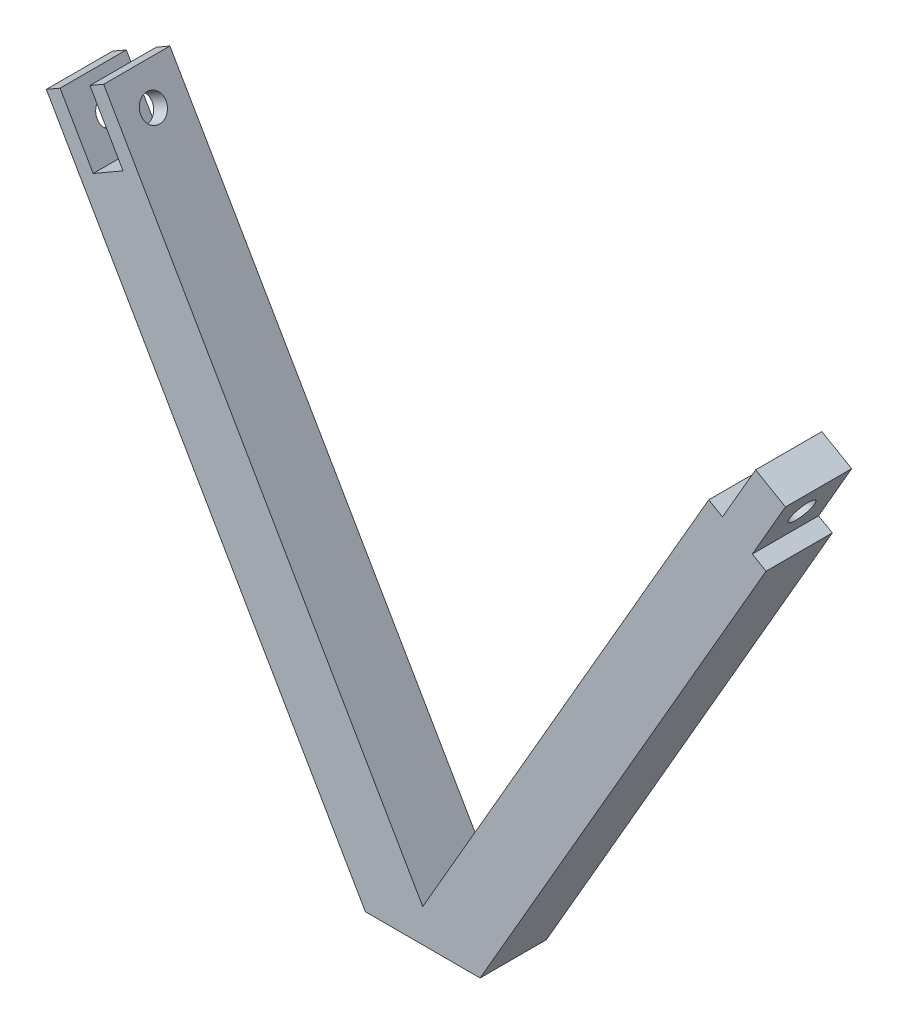
ISO-10303-21;
HEADER;
FILE_DESCRIPTION(('STEP AP214'),'2;1');
FILE_NAME('part.step','',(''),(''),'','','');
FILE_SCHEMA(('AUTOMOTIVE_DESIGN { 1 0 10303 214 1 1 1 1 }'));
ENDSEC;
DATA;
#1=APPLICATION_CONTEXT('core data for automotive mechanical design processes');
#2=APPLICATION_PROTOCOL_DEFINITION('international standard','automotive_design',2000,#1);
#3=PRODUCT_CONTEXT('',#1,'mechanical');
#4=PRODUCT('Part','Part','',(#3));
#5=PRODUCT_RELATED_PRODUCT_CATEGORY('part','',(#4));
#6=PRODUCT_DEFINITION_FORMATION('','',#4);
#7=PRODUCT_DEFINITION_CONTEXT('part definition',#1,'design');
#8=PRODUCT_DEFINITION('design','',#6,#7);
#9=PRODUCT_DEFINITION_SHAPE('','',#8);
#10=(LENGTH_UNIT() NAMED_UNIT(*) SI_UNIT(.MILLI.,.METRE.));
#11=(NAMED_UNIT(*) PLANE_ANGLE_UNIT() SI_UNIT($,.RADIAN.));
#12=(NAMED_UNIT(*) SI_UNIT($,.STERADIAN.) SOLID_ANGLE_UNIT());
#13=UNCERTAINTY_MEASURE_WITH_UNIT(LENGTH_MEASURE(1.E-05),#10,'distance_accuracy_value','');
#14=(GEOMETRIC_REPRESENTATION_CONTEXT(3) GLOBAL_UNCERTAINTY_ASSIGNED_CONTEXT((#13)) GLOBAL_UNIT_ASSIGNED_CONTEXT((#10,
#11,#12)) REPRESENTATION_CONTEXT('',''));
#15=CARTESIAN_POINT('',(0.,0.,0.));
#16=DIRECTION('',(0.,0.,1.));
#17=DIRECTION('',(1.,0.,0.));
#18=AXIS2_PLACEMENT_3D('',#15,#16,#17);
#19=CARTESIAN_POINT('',(0.,2.5,0.));
#20=DIRECTION('',(0.,1.,0.));
#21=DIRECTION('',(0.,0.,1.));
#22=AXIS2_PLACEMENT_3D('',#19,#20,#21);
#23=PLANE('',#22);
#24=DIRECTION('',(1.,0.,0.));
#25=VECTOR('',#24,1.);
#26=CARTESIAN_POINT('',(-47.8349364905389,2.5,2.5));
#27=LINE('',#26,#25);
#28=CARTESIAN_POINT('',(-54.3301270189222,2.5,2.5));
#29=VERTEX_POINT('',#28);
#30=CARTESIAN_POINT('',(-45.6698729810778,2.5,2.5));
#31=VERTEX_POINT('',#30);
#32=EDGE_CURVE('E225',#29,#31,#27,.T.);
#33=ORIENTED_EDGE('',*,*,#32,.F.);
#34=DIRECTION('',(0.,0.,-1.));
#35=VECTOR('',#34,1.);
#36=CARTESIAN_POINT('',(-54.3301270189222,2.5,7.5));
#37=LINE('',#36,#35);
#38=CARTESIAN_POINT('',(-54.3301270189222,2.5,-2.5));
#39=VERTEX_POINT('',#38);
#40=EDGE_CURVE('E74',#29,#39,#37,.T.);
#41=ORIENTED_EDGE('',*,*,#40,.T.);
#42=DIRECTION('',(-1.,0.,0.));
#43=VECTOR('',#42,1.);
#44=CARTESIAN_POINT('',(-47.8349364905389,2.5,-2.5));
#45=LINE('',#44,#43);
#46=CARTESIAN_POINT('',(-45.6698729810778,2.50000000000002,-2.5));
#47=VERTEX_POINT('',#46);
#48=EDGE_CURVE('E228',#47,#39,#45,.T.);
#49=ORIENTED_EDGE('',*,*,#48,.F.);
#50=DIRECTION('',(0.,0.,-1.));
#51=VECTOR('',#50,1.);
#52=CARTESIAN_POINT('',(-45.6698729810778,2.50000000000002,7.5));
#53=LINE('',#52,#51);
#54=EDGE_CURVE('E120',#31,#47,#53,.T.);
#55=ORIENTED_EDGE('',*,*,#54,.F.);
#56=EDGE_LOOP('',(#33,#41,#49,#55));
#57=FACE_BOUND('',#56,.T.);
#58=ADVANCED_FACE('F71',(#57),#23,.F.);
#59=CARTESIAN_POINT('',(-72.8349364905391,44.5512701892218,0.));
#60=DIRECTION('',(-0.866025403784436,-0.500000000000004,0.));
#61=DIRECTION('',(0.,0.,1.));
#62=AXIS2_PLACEMENT_3D('',#59,#60,#61);
#63=CYLINDRICAL_SURFACE('',#62,0.95);
#64=CARTESIAN_POINT('',(-72.8349364905391,44.5512701892218,0.));
#65=DIRECTION('',(-0.866025403784436,-0.500000000000004,0.));
#66=DIRECTION('',(0.,0.,1.));
#67=AXIS2_PLACEMENT_3D('',#64,#65,#66);
#68=CIRCLE('',#67,0.95);
#69=CARTESIAN_POINT('',(-72.8349364905391,44.5512701892218,0.95));
#70=VERTEX_POINT('',#69);
#71=EDGE_CURVE('E533',#70,#70,#68,.T.);
#72=ORIENTED_EDGE('',*,*,#71,.F.);
#73=EDGE_LOOP('',(#72));
#74=FACE_BOUND('',#73,.T.);
#75=CARTESIAN_POINT('',(-73.8741669750804,43.9512701892218,0.));
#76=DIRECTION('',(-0.866025403784436,-0.500000000000004,0.));
#77=DIRECTION('',(0.,0.,1.));
#78=AXIS2_PLACEMENT_3D('',#75,#76,#77);
#79=CIRCLE('',#78,0.95);
#80=CARTESIAN_POINT('',(-73.8741669750804,43.9512701892218,0.95));
#81=VERTEX_POINT('',#80);
#82=EDGE_CURVE('E515',#81,#81,#79,.T.);
#83=ORIENTED_EDGE('',*,*,#82,.T.);
#84=EDGE_LOOP('',(#83));
#85=FACE_BOUND('',#84,.T.);
#86=ADVANCED_FACE('F316',(#74,#85),#63,.F.);
#87=CARTESIAN_POINT('',(-26.1258330249199,43.951270189222,0.));
#88=DIRECTION('',(0.86602540378444,-0.499999999999998,0.));
#89=DIRECTION('',(0.,0.,-1.));
#90=AXIS2_PLACEMENT_3D('',#87,#88,#89);
#91=CYLINDRICAL_SURFACE('',#90,0.95);
#92=CARTESIAN_POINT('',(-26.1258330249199,43.951270189222,0.));
#93=DIRECTION('',(-0.86602540378444,0.499999999999998,0.));
#94=DIRECTION('',(0.,0.,1.));
#95=AXIS2_PLACEMENT_3D('',#92,#93,#94);
#96=CIRCLE('',#95,0.95);
#97=CARTESIAN_POINT('',(-26.1258330249199,43.951270189222,0.95));
#98=VERTEX_POINT('',#97);
#99=EDGE_CURVE('E166',#98,#98,#96,.T.);
#100=ORIENTED_EDGE('',*,*,#99,.T.);
#101=EDGE_LOOP('',(#100));
#102=FACE_BOUND('',#101,.T.);
#103=CARTESIAN_POINT('',(-23.8741669750803,42.651270189222,0.));
#104=DIRECTION('',(-0.86602540378444,0.499999999999998,0.));
#105=DIRECTION('',(0.,0.,1.));
#106=AXIS2_PLACEMENT_3D('',#103,#104,#105);
#107=CIRCLE('',#106,0.95);
#108=CARTESIAN_POINT('',(-23.8741669750803,42.651270189222,0.95));
#109=VERTEX_POINT('',#108);
#110=EDGE_CURVE('E174',#109,#109,#107,.T.);
#111=ORIENTED_EDGE('',*,*,#110,.F.);
#112=EDGE_LOOP('',(#111));
#113=FACE_BOUND('',#112,.T.);
#114=ADVANCED_FACE('F320',(#102,#113),#91,.F.);
#115=CARTESIAN_POINT('',(-77.1650635094613,42.0512701892218,0.));
#116=DIRECTION('',(0.866025403784436,0.500000000000004,0.));
#117=DIRECTION('',(0.,0.,-1.));
#118=AXIS2_PLACEMENT_3D('',#115,#116,#117);
#119=CYLINDRICAL_SURFACE('',#118,0.95);
#120=CARTESIAN_POINT('',(-77.1650635094613,42.0512701892218,0.));
#121=DIRECTION('',(-0.866025403784436,-0.500000000000004,0.));
#122=DIRECTION('',(0.,0.,1.));
#123=AXIS2_PLACEMENT_3D('',#120,#121,#122);
#124=CIRCLE('',#123,0.95);
#125=CARTESIAN_POINT('',(-77.1650635094613,42.0512701892218,0.95));
#126=VERTEX_POINT('',#125);
#127=EDGE_CURVE('E227',#126,#126,#124,.T.);
#128=ORIENTED_EDGE('',*,*,#127,.T.);
#129=EDGE_LOOP('',(#128));
#130=FACE_BOUND('',#129,.T.);
#131=CARTESIAN_POINT('',(-76.12583302492,42.6512701892218,0.));
#132=DIRECTION('',(-0.866025403784436,-0.500000000000004,0.));
#133=DIRECTION('',(0.,0.,1.));
#134=AXIS2_PLACEMENT_3D('',#131,#132,#133);
#135=CIRCLE('',#134,0.95);
#136=CARTESIAN_POINT('',(-76.12583302492,42.6512701892218,0.95));
#137=VERTEX_POINT('',#136);
#138=EDGE_CURVE('E510',#137,#137,#135,.T.);
#139=ORIENTED_EDGE('',*,*,#138,.F.);
#140=EDGE_LOOP('',(#139));
#141=FACE_BOUND('',#140,.T.);
#142=ADVANCED_FACE('F326',(#130,#141),#119,.F.);
#143=CARTESIAN_POINT('',(-78.4150635094613,44.2163336986829,-2.5));
#144=DIRECTION('',(0.500000000000004,-0.866025403784436,0.));
#145=DIRECTION('',(0.,0.,1.));
#146=AXIS2_PLACEMENT_3D('',#143,#144,#145);
#147=PLANE('',#146);
#148=DIRECTION('',(0.,0.,-1.));
#149=VECTOR('',#148,1.);
#150=CARTESIAN_POINT('',(-77.37583302492,44.8163336986829,-2.5));
#151=LINE('',#150,#149);
#152=CARTESIAN_POINT('',(-77.37583302492,44.8163336986829,2.5));
#153=VERTEX_POINT('',#152);
#154=CARTESIAN_POINT('',(-77.37583302492,44.8163336986829,-2.5));
#155=VERTEX_POINT('',#154);
#156=EDGE_CURVE('E506',#153,#155,#151,.T.);
#157=ORIENTED_EDGE('',*,*,#156,.T.);
#158=DIRECTION('',(0.866025403784436,0.500000000000004,0.));
#159=VECTOR('',#158,1.);
#160=CARTESIAN_POINT('',(-78.4150635094613,44.2163336986829,-2.5));
#161=LINE('',#160,#159);
#162=CARTESIAN_POINT('',(-78.4150635094613,44.2163336986829,-2.5));
#163=VERTEX_POINT('',#162);
#164=EDGE_CURVE('E81',#163,#155,#161,.T.);
#165=ORIENTED_EDGE('',*,*,#164,.F.);
#166=DIRECTION('',(0.,0.,-1.));
#167=VECTOR('',#166,1.);
#168=CARTESIAN_POINT('',(-78.4150635094613,44.2163336986829,-2.5));
#169=LINE('',#168,#167);
#170=CARTESIAN_POINT('',(-78.4150635094613,44.2163336986829,2.5));
#171=VERTEX_POINT('',#170);
#172=EDGE_CURVE('E196',#171,#163,#169,.T.);
#173=ORIENTED_EDGE('',*,*,#172,.F.);
#174=DIRECTION('',(0.866025403784436,0.500000000000004,0.));
#175=VECTOR('',#174,1.);
#176=CARTESIAN_POINT('',(-78.4150635094613,44.2163336986829,2.5));
#177=LINE('',#176,#175);
#178=EDGE_CURVE('E508',#171,#153,#177,.T.);
#179=ORIENTED_EDGE('',*,*,#178,.T.);
#180=EDGE_LOOP('',(#157,#165,#173,#179));
#181=FACE_BOUND('',#180,.T.);
#182=ADVANCED_FACE('F333',(#181),#147,.F.);
#183=CARTESIAN_POINT('',(-76.12583302492,42.6512701892218,0.));
#184=DIRECTION('',(-0.866025403784436,-0.500000000000004,0.));
#185=DIRECTION('',(0.,0.,1.));
#186=AXIS2_PLACEMENT_3D('',#183,#184,#185);
#187=PLANE('',#186);
#188=ORIENTED_EDGE('',*,*,#156,.F.);
#189=DIRECTION('',(-0.500000000000004,0.866025403784436,0.));
#190=VECTOR('',#189,1.);
#191=CARTESIAN_POINT('',(-74.87583302492,40.4862066797607,2.5));
#192=LINE('',#191,#190);
#193=CARTESIAN_POINT('',(-74.87583302492,40.4862066797607,2.5));
#194=VERTEX_POINT('',#193);
#195=EDGE_CURVE('E222',#194,#153,#192,.T.);
#196=ORIENTED_EDGE('',*,*,#195,.F.);
#197=DIRECTION('',(0.,0.,1.));
#198=VECTOR('',#197,1.);
#199=CARTESIAN_POINT('',(-74.87583302492,40.4862066797607,-2.5));
#200=LINE('',#199,#198);
#201=CARTESIAN_POINT('',(-74.87583302492,40.4862066797607,-2.5));
#202=VERTEX_POINT('',#201);
#203=EDGE_CURVE('E523',#202,#194,#200,.T.);
#204=ORIENTED_EDGE('',*,*,#203,.F.);
#205=DIRECTION('',(0.500000000000004,-0.866025403784436,0.));
#206=VECTOR('',#205,1.);
#207=CARTESIAN_POINT('',(-74.87583302492,40.4862066797607,-2.5));
#208=LINE('',#207,#206);
#209=EDGE_CURVE('E520',#155,#202,#208,.T.);
#210=ORIENTED_EDGE('',*,*,#209,.F.);
#211=EDGE_LOOP('',(#188,#196,#204,#210));
#212=FACE_BOUND('',#211,.T.);
#213=ORIENTED_EDGE('',*,*,#138,.T.);
#214=EDGE_LOOP('',(#213));
#215=FACE_BOUND('',#214,.T.);
#216=ADVANCED_FACE('F346',(#212,#215),#187,.F.);
#217=CARTESIAN_POINT('',(-73.7500000000002,41.1362066797607,0.));
#218=DIRECTION('',(0.500000000000004,-0.866025403784436,0.));
#219=DIRECTION('',(0.,0.,1.));
#220=AXIS2_PLACEMENT_3D('',#217,#218,#219);
#221=PLANE('',#220);
#222=DIRECTION('',(0.866025403784436,0.500000000000004,0.));
#223=VECTOR('',#222,1.);
#224=CARTESIAN_POINT('',(-75.9150635094613,39.8862066797607,-2.5));
#225=LINE('',#224,#223);
#226=CARTESIAN_POINT('',(-72.6241669750804,41.7862066797607,-2.5));
#227=VERTEX_POINT('',#226);
#228=EDGE_CURVE('E216',#202,#227,#225,.T.);
#229=ORIENTED_EDGE('',*,*,#228,.F.);
#230=ORIENTED_EDGE('',*,*,#203,.T.);
#231=DIRECTION('',(-0.866025403784436,-0.500000000000004,0.));
#232=VECTOR('',#231,1.);
#233=CARTESIAN_POINT('',(-75.9150635094613,39.8862066797607,2.5));
#234=LINE('',#233,#232);
#235=CARTESIAN_POINT('',(-72.6241669750804,41.7862066797607,2.5));
#236=VERTEX_POINT('',#235);
#237=EDGE_CURVE('E529',#236,#194,#234,.T.);
#238=ORIENTED_EDGE('',*,*,#237,.F.);
#239=DIRECTION('',(0.,0.,1.));
#240=VECTOR('',#239,1.);
#241=CARTESIAN_POINT('',(-72.6241669750804,41.7862066797607,-2.5));
#242=LINE('',#241,#240);
#243=EDGE_CURVE('E554',#227,#236,#242,.T.);
#244=ORIENTED_EDGE('',*,*,#243,.F.);
#245=EDGE_LOOP('',(#229,#230,#238,#244));
#246=FACE_BOUND('',#245,.T.);
#247=ADVANCED_FACE('F339',(#246),#221,.F.);
#248=CARTESIAN_POINT('',(-73.8741669750804,43.9512701892218,0.));
#249=DIRECTION('',(-0.866025403784436,-0.500000000000004,0.));
#250=DIRECTION('',(0.,0.,1.));
#251=AXIS2_PLACEMENT_3D('',#248,#249,#250);
#252=PLANE('',#251);
#253=ORIENTED_EDGE('',*,*,#82,.F.);
#254=EDGE_LOOP('',(#253));
#255=FACE_BOUND('',#254,.T.);
#256=DIRECTION('',(0.,0.,-1.));
#257=VECTOR('',#256,1.);
#258=CARTESIAN_POINT('',(-75.1241669750805,46.1163336986829,-2.5));
#259=LINE('',#258,#257);
#260=CARTESIAN_POINT('',(-75.1241669750805,46.1163336986829,2.5));
#261=VERTEX_POINT('',#260);
#262=CARTESIAN_POINT('',(-75.1241669750805,46.1163336986829,-2.5));
#263=VERTEX_POINT('',#262);
#264=EDGE_CURVE('E546',#261,#263,#259,.T.);
#265=ORIENTED_EDGE('',*,*,#264,.T.);
#266=DIRECTION('',(0.500000000000004,-0.866025403784436,0.));
#267=VECTOR('',#266,1.);
#268=CARTESIAN_POINT('',(-72.6241669750804,41.7862066797607,-2.5));
#269=LINE('',#268,#267);
#270=EDGE_CURVE('E550',#263,#227,#269,.T.);
#271=ORIENTED_EDGE('',*,*,#270,.T.);
#272=ORIENTED_EDGE('',*,*,#243,.T.);
#273=DIRECTION('',(-0.500000000000004,0.866025403784436,0.));
#274=VECTOR('',#273,1.);
#275=CARTESIAN_POINT('',(-72.6241669750804,41.7862066797607,2.5));
#276=LINE('',#275,#274);
#277=EDGE_CURVE('E541',#236,#261,#276,.T.);
#278=ORIENTED_EDGE('',*,*,#277,.T.);
#279=EDGE_LOOP('',(#265,#271,#272,#278));
#280=FACE_BOUND('',#279,.T.);
#281=ADVANCED_FACE('F335',(#255,#280),#252,.T.);
#282=CARTESIAN_POINT('',(-74.0849364905391,46.7163336986829,-2.5));
#283=DIRECTION('',(-0.500000000000004,0.866025403784436,0.));
#284=DIRECTION('',(0.,0.,-1.));
#285=AXIS2_PLACEMENT_3D('',#282,#283,#284);
#286=PLANE('',#285);
#287=ORIENTED_EDGE('',*,*,#264,.F.);
#288=DIRECTION('',(-0.866025403784436,-0.500000000000004,0.));
#289=VECTOR('',#288,1.);
#290=CARTESIAN_POINT('',(-74.0849364905391,46.7163336986829,2.5));
#291=LINE('',#290,#289);
#292=CARTESIAN_POINT('',(-74.0849364905391,46.7163336986829,2.5));
#293=VERTEX_POINT('',#292);
#294=EDGE_CURVE('E561',#293,#261,#291,.T.);
#295=ORIENTED_EDGE('',*,*,#294,.F.);
#296=DIRECTION('',(0.,0.,-1.));
#297=VECTOR('',#296,1.);
#298=CARTESIAN_POINT('',(-74.0849364905391,46.7163336986829,-2.5));
#299=LINE('',#298,#297);
#300=CARTESIAN_POINT('',(-74.0849364905391,46.7163336986829,-2.5));
#301=VERTEX_POINT('',#300);
#302=EDGE_CURVE('E537',#293,#301,#299,.T.);
#303=ORIENTED_EDGE('',*,*,#302,.T.);
#304=DIRECTION('',(-0.866025403784436,-0.500000000000004,0.));
#305=VECTOR('',#304,1.);
#306=CARTESIAN_POINT('',(-74.0849364905391,46.7163336986829,-2.5));
#307=LINE('',#306,#305);
#308=EDGE_CURVE('E545',#301,#263,#307,.T.);
#309=ORIENTED_EDGE('',*,*,#308,.T.);
#310=EDGE_LOOP('',(#287,#295,#303,#309));
#311=FACE_BOUND('',#310,.T.);
#312=ADVANCED_FACE('F338',(#311),#286,.T.);
#313=CARTESIAN_POINT('',(-47.8349364905389,1.25000000000001,-2.5));
#314=DIRECTION('',(-0.866025403784436,-0.500000000000004,0.));
#315=DIRECTION('',(0.,0.,1.));
#316=AXIS2_PLACEMENT_3D('',#313,#314,#315);
#317=PLANE('',#316);
#318=DIRECTION('',(-0.500000000000004,0.866025403784436,0.));
#319=VECTOR('',#318,1.);
#320=CARTESIAN_POINT('',(-47.8349364905389,1.25000000000001,2.5));
#321=LINE('',#320,#319);
#322=CARTESIAN_POINT('',(-50.,5.,2.5));
#323=VERTEX_POINT('',#322);
#324=EDGE_CURVE('E564',#323,#293,#321,.T.);
#325=ORIENTED_EDGE('',*,*,#324,.F.);
#326=DIRECTION('',(0.,0.,-1.));
#327=VECTOR('',#326,1.);
#328=CARTESIAN_POINT('',(-50.,5.,7.5));
#329=LINE('',#328,#327);
#330=CARTESIAN_POINT('',(-50.,5.,-2.5));
#331=VERTEX_POINT('',#330);
#332=EDGE_CURVE('E192',#323,#331,#329,.T.);
#333=ORIENTED_EDGE('',*,*,#332,.T.);
#334=DIRECTION('',(-0.500000000000004,0.866025403784436,0.));
#335=VECTOR('',#334,1.);
#336=CARTESIAN_POINT('',(-47.8349364905389,1.25000000000001,-2.5));
#337=LINE('',#336,#335);
#338=EDGE_CURVE('E197',#331,#301,#337,.T.);
#339=ORIENTED_EDGE('',*,*,#338,.T.);
#340=ORIENTED_EDGE('',*,*,#302,.F.);
#341=EDGE_LOOP('',(#325,#333,#339,#340));
#342=FACE_BOUND('',#341,.T.);
#343=ORIENTED_EDGE('',*,*,#71,.T.);
#344=EDGE_LOOP('',(#343));
#345=FACE_BOUND('',#344,.T.);
#346=ADVANCED_FACE('F310',(#342,#345),#317,.F.);
#347=CARTESIAN_POINT('',(-52.1650635094611,1.24999999999999,-2.5));
#348=DIRECTION('',(0.86602540378444,-0.499999999999998,0.));
#349=DIRECTION('',(0.,0.,-1.));
#350=AXIS2_PLACEMENT_3D('',#347,#348,#349);
#351=PLANE('',#350);
#352=ORIENTED_EDGE('',*,*,#332,.F.);
#353=DIRECTION('',(0.499999999999998,0.86602540378444,0.));
#354=VECTOR('',#353,1.);
#355=CARTESIAN_POINT('',(-52.1650635094611,1.24999999999999,2.5));
#356=LINE('',#355,#354);
#357=CARTESIAN_POINT('',(-28.4150635094612,42.3862066797609,2.5));
#358=VERTEX_POINT('',#357);
#359=EDGE_CURVE('E212',#323,#358,#356,.T.);
#360=ORIENTED_EDGE('',*,*,#359,.T.);
#361=DIRECTION('',(0.,0.,-1.));
#362=VECTOR('',#361,1.);
#363=CARTESIAN_POINT('',(-28.4150635094612,42.3862066797609,-2.5));
#364=LINE('',#363,#362);
#365=CARTESIAN_POINT('',(-28.4150635094612,42.3862066797609,-2.5));
#366=VERTEX_POINT('',#365);
#367=EDGE_CURVE('E200',#358,#366,#364,.T.);
#368=ORIENTED_EDGE('',*,*,#367,.T.);
#369=DIRECTION('',(0.499999999999998,0.86602540378444,0.));
#370=VECTOR('',#369,1.);
#371=CARTESIAN_POINT('',(-52.1650635094611,1.24999999999999,-2.5));
#372=LINE('',#371,#370);
#373=EDGE_CURVE('E204',#331,#366,#372,.T.);
#374=ORIENTED_EDGE('',*,*,#373,.F.);
#375=EDGE_LOOP('',(#352,#360,#368,#374));
#376=FACE_BOUND('',#375,.T.);
#377=ADVANCED_FACE('F297',(#376),#351,.F.);
#378=CARTESIAN_POINT('',(-26.2500000000001,41.1362066797609,0.));
#379=DIRECTION('',(-0.499999999999998,-0.86602540378444,0.));
#380=DIRECTION('',(0.,0.,1.));
#381=AXIS2_PLACEMENT_3D('',#378,#379,#380);
#382=PLANE('',#381);
#383=DIRECTION('',(0.,0.,1.));
#384=VECTOR('',#383,1.);
#385=CARTESIAN_POINT('',(-27.3758330249199,41.7862066797609,-2.5));
#386=LINE('',#385,#384);
#387=CARTESIAN_POINT('',(-27.3758330249199,41.7862066797609,-2.5));
#388=VERTEX_POINT('',#387);
#389=CARTESIAN_POINT('',(-27.3758330249199,41.7862066797609,2.5));
#390=VERTEX_POINT('',#389);
#391=EDGE_CURVE('E90',#388,#390,#386,.T.);
#392=ORIENTED_EDGE('',*,*,#391,.F.);
#393=DIRECTION('',(0.86602540378444,-0.499999999999998,0.));
#394=VECTOR('',#393,1.);
#395=CARTESIAN_POINT('',(-28.4150635094612,42.3862066797609,-2.5));
#396=LINE('',#395,#394);
#397=EDGE_CURVE('E191',#366,#388,#396,.T.);
#398=ORIENTED_EDGE('',*,*,#397,.F.);
#399=ORIENTED_EDGE('',*,*,#367,.F.);
#400=DIRECTION('',(-0.86602540378444,0.499999999999998,0.));
#401=VECTOR('',#400,1.);
#402=CARTESIAN_POINT('',(-28.4150635094612,42.3862066797609,2.5));
#403=LINE('',#402,#401);
#404=EDGE_CURVE('E156',#390,#358,#403,.T.);
#405=ORIENTED_EDGE('',*,*,#404,.F.);
#406=EDGE_LOOP('',(#392,#398,#399,#405));
#407=FACE_BOUND('',#406,.T.);
#408=ADVANCED_FACE('F299',(#407),#382,.F.);
#409=CARTESIAN_POINT('',(-26.1258330249199,43.951270189222,0.));
#410=DIRECTION('',(-0.86602540378444,0.499999999999998,0.));
#411=DIRECTION('',(0.,0.,1.));
#412=AXIS2_PLACEMENT_3D('',#409,#410,#411);
#413=PLANE('',#412);
#414=DIRECTION('',(0.,0.,-1.));
#415=VECTOR('',#414,1.);
#416=CARTESIAN_POINT('',(-24.8758330249199,46.1163336986831,-2.5));
#417=LINE('',#416,#415);
#418=CARTESIAN_POINT('',(-24.8758330249199,46.1163336986831,2.5));
#419=VERTEX_POINT('',#418);
#420=CARTESIAN_POINT('',(-24.8758330249199,46.1163336986831,-2.5));
#421=VERTEX_POINT('',#420);
#422=EDGE_CURVE('E164',#419,#421,#417,.T.);
#423=ORIENTED_EDGE('',*,*,#422,.T.);
#424=DIRECTION('',(-0.499999999999998,-0.86602540378444,0.));
#425=VECTOR('',#424,1.);
#426=CARTESIAN_POINT('',(-27.3758330249199,41.7862066797609,-2.5));
#427=LINE('',#426,#425);
#428=EDGE_CURVE('E290',#421,#388,#427,.T.);
#429=ORIENTED_EDGE('',*,*,#428,.T.);
#430=ORIENTED_EDGE('',*,*,#391,.T.);
#431=DIRECTION('',(0.499999999999998,0.86602540378444,0.));
#432=VECTOR('',#431,1.);
#433=CARTESIAN_POINT('',(-27.3758330249199,41.7862066797609,2.5));
#434=LINE('',#433,#432);
#435=EDGE_CURVE('E178',#390,#419,#434,.T.);
#436=ORIENTED_EDGE('',*,*,#435,.T.);
#437=EDGE_LOOP('',(#423,#429,#430,#436));
#438=FACE_BOUND('',#437,.T.);
#439=ORIENTED_EDGE('',*,*,#99,.F.);
#440=EDGE_LOOP('',(#439));
#441=FACE_BOUND('',#440,.T.);
#442=ADVANCED_FACE('F301',(#438,#441),#413,.T.);
#443=CARTESIAN_POINT('',(-24.8758330249199,46.1163336986831,-2.5));
#444=DIRECTION('',(-0.499999999999998,-0.86602540378444,0.));
#445=DIRECTION('',(0.,0.,1.));
#446=AXIS2_PLACEMENT_3D('',#443,#444,#445);
#447=PLANE('',#446);
#448=DIRECTION('',(0.,0.,-1.));
#449=VECTOR('',#448,1.);
#450=CARTESIAN_POINT('',(-22.6241669750803,44.8163336986831,-2.5));
#451=LINE('',#450,#449);
#452=CARTESIAN_POINT('',(-22.6241669750803,44.8163336986831,2.5));
#453=VERTEX_POINT('',#452);
#454=CARTESIAN_POINT('',(-22.6241669750803,44.8163336986831,-2.5));
#455=VERTEX_POINT('',#454);
#456=EDGE_CURVE('E162',#453,#455,#451,.T.);
#457=ORIENTED_EDGE('',*,*,#456,.T.);
#458=DIRECTION('',(0.86602540378444,-0.499999999999998,0.));
#459=VECTOR('',#458,1.);
#460=CARTESIAN_POINT('',(-24.8758330249199,46.1163336986831,-2.5));
#461=LINE('',#460,#459);
#462=EDGE_CURVE('E185',#421,#455,#461,.T.);
#463=ORIENTED_EDGE('',*,*,#462,.F.);
#464=ORIENTED_EDGE('',*,*,#422,.F.);
#465=DIRECTION('',(0.86602540378444,-0.499999999999998,0.));
#466=VECTOR('',#465,1.);
#467=CARTESIAN_POINT('',(-24.8758330249199,46.1163336986831,2.5));
#468=LINE('',#467,#466);
#469=EDGE_CURVE('E150',#419,#453,#468,.T.);
#470=ORIENTED_EDGE('',*,*,#469,.T.);
#471=EDGE_LOOP('',(#457,#463,#464,#470));
#472=FACE_BOUND('',#471,.T.);
#473=ADVANCED_FACE('F160',(#472),#447,.F.);
#474=CARTESIAN_POINT('',(-23.8741669750803,42.651270189222,0.));
#475=DIRECTION('',(-0.86602540378444,0.499999999999998,0.));
#476=DIRECTION('',(0.,0.,1.));
#477=AXIS2_PLACEMENT_3D('',#474,#475,#476);
#478=PLANE('',#477);
#479=ORIENTED_EDGE('',*,*,#456,.F.);
#480=DIRECTION('',(0.499999999999998,0.86602540378444,0.));
#481=VECTOR('',#480,1.);
#482=CARTESIAN_POINT('',(-25.1241669750803,40.4862066797609,2.5));
#483=LINE('',#482,#481);
#484=CARTESIAN_POINT('',(-25.1241669750803,40.4862066797609,2.5));
#485=VERTEX_POINT('',#484);
#486=EDGE_CURVE('E145',#485,#453,#483,.T.);
#487=ORIENTED_EDGE('',*,*,#486,.F.);
#488=DIRECTION('',(0.,0.,1.));
#489=VECTOR('',#488,1.);
#490=CARTESIAN_POINT('',(-25.1241669750803,40.4862066797609,-2.5));
#491=LINE('',#490,#489);
#492=CARTESIAN_POINT('',(-25.1241669750803,40.4862066797609,-2.5));
#493=VERTEX_POINT('',#492);
#494=EDGE_CURVE('E111',#493,#485,#491,.T.);
#495=ORIENTED_EDGE('',*,*,#494,.F.);
#496=DIRECTION('',(-0.499999999999998,-0.86602540378444,0.));
#497=VECTOR('',#496,1.);
#498=CARTESIAN_POINT('',(-25.1241669750803,40.4862066797609,-2.5));
#499=LINE('',#498,#497);
#500=EDGE_CURVE('E171',#455,#493,#499,.T.);
#501=ORIENTED_EDGE('',*,*,#500,.F.);
#502=EDGE_LOOP('',(#479,#487,#495,#501));
#503=FACE_BOUND('',#502,.T.);
#504=ORIENTED_EDGE('',*,*,#110,.T.);
#505=EDGE_LOOP('',(#504));
#506=FACE_BOUND('',#505,.T.);
#507=ADVANCED_FACE('F169',(#503,#506),#478,.F.);
#508=CARTESIAN_POINT('',(-24.084936490539,39.8862066797609,-2.5));
#509=VERTEX_POINT('',#508);
#510=EDGE_CURVE('E104',#493,#509,#396,.T.);
#511=ORIENTED_EDGE('',*,*,#510,.F.);
#512=ORIENTED_EDGE('',*,*,#494,.T.);
#513=CARTESIAN_POINT('',(-24.084936490539,39.8862066797609,2.5));
#514=VERTEX_POINT('',#513);
#515=EDGE_CURVE('E152',#514,#485,#403,.T.);
#516=ORIENTED_EDGE('',*,*,#515,.F.);
#517=DIRECTION('',(0.,0.,1.));
#518=VECTOR('',#517,1.);
#519=CARTESIAN_POINT('',(-24.084936490539,39.8862066797609,-2.5));
#520=LINE('',#519,#518);
#521=EDGE_CURVE('E187',#509,#514,#520,.T.);
#522=ORIENTED_EDGE('',*,*,#521,.F.);
#523=EDGE_LOOP('',(#511,#512,#516,#522));
#524=FACE_BOUND('',#523,.T.);
#525=ADVANCED_FACE('F303',(#524),#382,.F.);
#526=CARTESIAN_POINT('',(-47.8349364905389,-1.24999999999999,-2.5));
#527=DIRECTION('',(-0.86602540378444,0.499999999999998,0.));
#528=DIRECTION('',(0.,0.,1.));
#529=AXIS2_PLACEMENT_3D('',#526,#527,#528);
#530=PLANE('',#529);
#531=DIRECTION('',(0.499999999999998,0.86602540378444,0.));
#532=VECTOR('',#531,1.);
#533=CARTESIAN_POINT('',(-47.8349364905389,-1.24999999999999,2.5));
#534=LINE('',#533,#532);
#535=EDGE_CURVE('E137',#31,#514,#534,.T.);
#536=ORIENTED_EDGE('',*,*,#535,.F.);
#537=ORIENTED_EDGE('',*,*,#54,.T.);
#538=DIRECTION('',(0.499999999999998,0.86602540378444,0.));
#539=VECTOR('',#538,1.);
#540=CARTESIAN_POINT('',(-47.8349364905389,-1.24999999999999,-2.5));
#541=LINE('',#540,#539);
#542=EDGE_CURVE('E201',#47,#509,#541,.T.);
#543=ORIENTED_EDGE('',*,*,#542,.T.);
#544=ORIENTED_EDGE('',*,*,#521,.T.);
#545=EDGE_LOOP('',(#536,#537,#543,#544));
#546=FACE_BOUND('',#545,.T.);
#547=ADVANCED_FACE('F314',(#546),#530,.F.);
#548=CARTESIAN_POINT('',(-52.1650635094611,-1.25000000000001,-2.5));
#549=DIRECTION('',(0.866025403784436,0.500000000000004,0.));
#550=DIRECTION('',(0.,0.,-1.));
#551=AXIS2_PLACEMENT_3D('',#548,#549,#550);
#552=PLANE('',#551);
#553=ORIENTED_EDGE('',*,*,#40,.F.);
#554=DIRECTION('',(-0.500000000000004,0.866025403784436,0.));
#555=VECTOR('',#554,1.);
#556=CARTESIAN_POINT('',(-52.1650635094611,-1.25000000000001,2.5));
#557=LINE('',#556,#555);
#558=EDGE_CURVE('E527',#29,#171,#557,.T.);
#559=ORIENTED_EDGE('',*,*,#558,.T.);
#560=ORIENTED_EDGE('',*,*,#172,.T.);
#561=DIRECTION('',(-0.500000000000004,0.866025403784436,0.));
#562=VECTOR('',#561,1.);
#563=CARTESIAN_POINT('',(-52.1650635094611,-1.25000000000001,-2.5));
#564=LINE('',#563,#562);
#565=EDGE_CURVE('E13',#39,#163,#564,.T.);
#566=ORIENTED_EDGE('',*,*,#565,.F.);
#567=EDGE_LOOP('',(#553,#559,#560,#566));
#568=FACE_BOUND('',#567,.T.);
#569=ORIENTED_EDGE('',*,*,#127,.F.);
#570=EDGE_LOOP('',(#569));
#571=FACE_BOUND('',#570,.T.);
#572=ADVANCED_FACE('F246',(#568,#571),#552,.F.);
#573=CARTESIAN_POINT('',(-47.8349364905389,1.25000000000002,2.5));
#574=DIRECTION('',(0.,0.,-1.));
#575=DIRECTION('',(-0.50000000000001,0.866025403784433,0.));
#576=AXIS2_PLACEMENT_3D('',#573,#574,#575);
#577=PLANE('',#576);
#578=ORIENTED_EDGE('',*,*,#558,.F.);
#579=ORIENTED_EDGE('',*,*,#32,.T.);
#580=ORIENTED_EDGE('',*,*,#535,.T.);
#581=ORIENTED_EDGE('',*,*,#515,.T.);
#582=ORIENTED_EDGE('',*,*,#486,.T.);
#583=ORIENTED_EDGE('',*,*,#469,.F.);
#584=ORIENTED_EDGE('',*,*,#435,.F.);
#585=ORIENTED_EDGE('',*,*,#404,.T.);
#586=ORIENTED_EDGE('',*,*,#359,.F.);
#587=ORIENTED_EDGE('',*,*,#324,.T.);
#588=ORIENTED_EDGE('',*,*,#294,.T.);
#589=ORIENTED_EDGE('',*,*,#277,.F.);
#590=ORIENTED_EDGE('',*,*,#237,.T.);
#591=ORIENTED_EDGE('',*,*,#195,.T.);
#592=ORIENTED_EDGE('',*,*,#178,.F.);
#593=EDGE_LOOP('',(#578,#579,#580,#581,#582,#583,#584,#585,#586,#587,#588,#589,#590,#591,#592));
#594=FACE_BOUND('',#593,.T.);
#595=ADVANCED_FACE('F148',(#594),#577,.F.);
#596=CARTESIAN_POINT('',(-47.8349364905389,1.25000000000002,-2.5));
#597=DIRECTION('',(0.,0.,1.));
#598=DIRECTION('',(0.50000000000001,-0.866025403784433,0.));
#599=AXIS2_PLACEMENT_3D('',#596,#597,#598);
#600=PLANE('',#599);
#601=ORIENTED_EDGE('',*,*,#542,.F.);
#602=ORIENTED_EDGE('',*,*,#48,.T.);
#603=ORIENTED_EDGE('',*,*,#565,.T.);
#604=ORIENTED_EDGE('',*,*,#164,.T.);
#605=ORIENTED_EDGE('',*,*,#209,.T.);
#606=ORIENTED_EDGE('',*,*,#228,.T.);
#607=ORIENTED_EDGE('',*,*,#270,.F.);
#608=ORIENTED_EDGE('',*,*,#308,.F.);
#609=ORIENTED_EDGE('',*,*,#338,.F.);
#610=ORIENTED_EDGE('',*,*,#373,.T.);
#611=ORIENTED_EDGE('',*,*,#397,.T.);
#612=ORIENTED_EDGE('',*,*,#428,.F.);
#613=ORIENTED_EDGE('',*,*,#462,.T.);
#614=ORIENTED_EDGE('',*,*,#500,.T.);
#615=ORIENTED_EDGE('',*,*,#510,.T.);
#616=EDGE_LOOP('',(#601,#602,#603,#604,#605,#606,#607,#608,#609,#610,#611,#612,#613,#614,#615));
#617=FACE_BOUND('',#616,.T.);
#618=ADVANCED_FACE('F251',(#617),#600,.F.);
#619=CLOSED_SHELL('',(#58,#86,#114,#142,#182,#216,#247,#281,#312,#346,#377,#408,#442,#473,#507,
#525,#547,#572,#595,#618));
#620=MANIFOLD_SOLID_BREP('B2',#619);
#621=ADVANCED_BREP_SHAPE_REPRESENTATION('',(#18,#620),#14);
#622=SHAPE_DEFINITION_REPRESENTATION(#9,#621);
ENDSEC;
END-ISO-10303-21;
